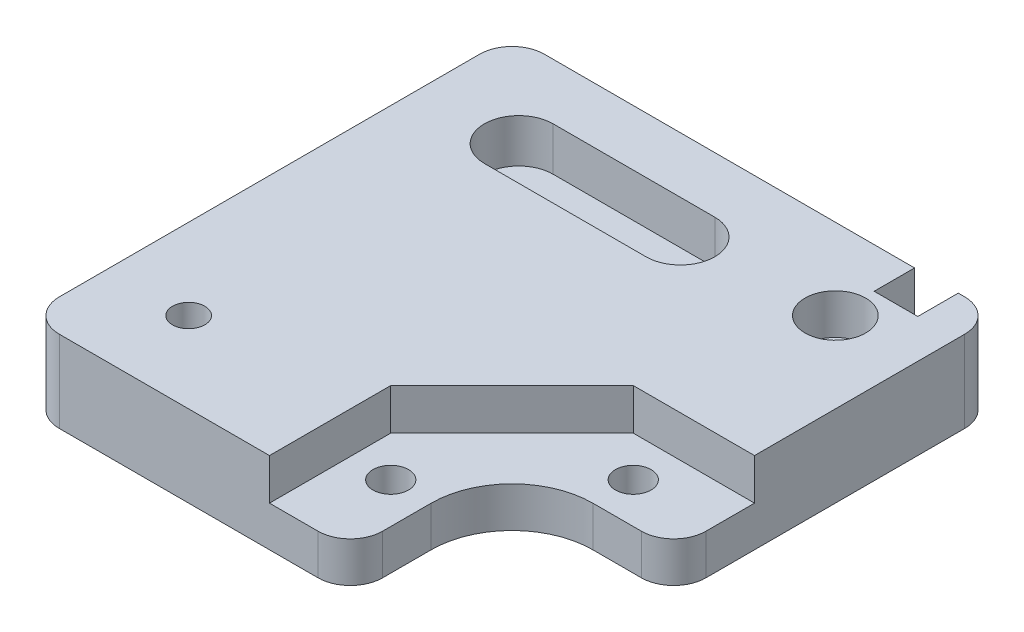
ISO-10303-21;
HEADER;
FILE_DESCRIPTION(('STEP AP214'),'2;1');
FILE_NAME('part.step','',(''),(''),'','','');
FILE_SCHEMA(('AUTOMOTIVE_DESIGN { 1 0 10303 214 1 1 1 1 }'));
ENDSEC;
DATA;
#1=APPLICATION_CONTEXT('core data for automotive mechanical design processes');
#2=APPLICATION_PROTOCOL_DEFINITION('international standard','automotive_design',2000,#1);
#3=PRODUCT_CONTEXT('',#1,'mechanical');
#4=PRODUCT('Part','Part','',(#3));
#5=PRODUCT_RELATED_PRODUCT_CATEGORY('part','',(#4));
#6=PRODUCT_DEFINITION_FORMATION('','',#4);
#7=PRODUCT_DEFINITION_CONTEXT('part definition',#1,'design');
#8=PRODUCT_DEFINITION('design','',#6,#7);
#9=PRODUCT_DEFINITION_SHAPE('','',#8);
#10=(LENGTH_UNIT() NAMED_UNIT(*) SI_UNIT(.MILLI.,.METRE.));
#11=(NAMED_UNIT(*) PLANE_ANGLE_UNIT() SI_UNIT($,.RADIAN.));
#12=(NAMED_UNIT(*) SI_UNIT($,.STERADIAN.) SOLID_ANGLE_UNIT());
#13=UNCERTAINTY_MEASURE_WITH_UNIT(LENGTH_MEASURE(1.E-05),#10,'distance_accuracy_value','');
#14=(GEOMETRIC_REPRESENTATION_CONTEXT(3) GLOBAL_UNCERTAINTY_ASSIGNED_CONTEXT((#13)) GLOBAL_UNIT_ASSIGNED_CONTEXT((#10,
#11,#12)) REPRESENTATION_CONTEXT('',''));
#15=CARTESIAN_POINT('',(0.,0.,0.));
#16=DIRECTION('',(0.,0.,1.));
#17=DIRECTION('',(1.,0.,0.));
#18=AXIS2_PLACEMENT_3D('',#15,#16,#17);
#19=CARTESIAN_POINT('',(20.,10.1,-60.));
#20=DIRECTION('',(0.,0.,1.));
#21=DIRECTION('',(1.,0.,0.));
#22=AXIS2_PLACEMENT_3D('',#19,#20,#21);
#23=PLANE('',#22);
#24=DIRECTION('',(0.,-1.,0.));
#25=VECTOR('',#24,1.);
#26=CARTESIAN_POINT('',(16.,10.1,-60.));
#27=LINE('',#26,#25);
#28=CARTESIAN_POINT('',(16.,10.1,-60.));
#29=VERTEX_POINT('',#28);
#30=CARTESIAN_POINT('',(16.,5.,-60.));
#31=VERTEX_POINT('',#30);
#32=EDGE_CURVE('E458',#29,#31,#27,.T.);
#33=ORIENTED_EDGE('',*,*,#32,.T.);
#34=DIRECTION('',(1.,0.,0.));
#35=VECTOR('',#34,1.);
#36=CARTESIAN_POINT('',(16.,5.,-60.));
#37=LINE('',#36,#35);
#38=CARTESIAN_POINT('',(15.2,5.,-60.));
#39=VERTEX_POINT('',#38);
#40=EDGE_CURVE('E54',#39,#31,#37,.T.);
#41=ORIENTED_EDGE('',*,*,#40,.F.);
#42=DIRECTION('',(0.,-1.,0.));
#43=VECTOR('',#42,1.);
#44=CARTESIAN_POINT('',(15.2,10.1,-60.));
#45=LINE('',#44,#43);
#46=CARTESIAN_POINT('',(15.2,10.1,-60.));
#47=VERTEX_POINT('',#46);
#48=EDGE_CURVE('E250',#47,#39,#45,.T.);
#49=ORIENTED_EDGE('',*,*,#48,.F.);
#50=DIRECTION('',(-1.,0.,0.));
#51=VECTOR('',#50,1.);
#52=CARTESIAN_POINT('',(20.,10.1,-60.));
#53=LINE('',#52,#51);
#54=EDGE_CURVE('E398',#29,#47,#53,.T.);
#55=ORIENTED_EDGE('',*,*,#54,.F.);
#56=EDGE_LOOP('',(#33,#41,#49,#55));
#57=FACE_BOUND('',#56,.T.);
#58=ADVANCED_FACE('F39',(#57),#23,.F.);
#59=CARTESIAN_POINT('',(10.0000000000014,0.,-50.0000000000072));
#60=DIRECTION('',(0.,1.,0.));
#61=DIRECTION('',(0.,0.,1.));
#62=AXIS2_PLACEMENT_3D('',#59,#60,#61);
#63=CYLINDRICAL_SURFACE('',#62,2.);
#64=CARTESIAN_POINT('',(10.0000000000014,0.,-50.0000000000072));
#65=DIRECTION('',(0.,1.,0.));
#66=DIRECTION('',(0.,0.,-1.));
#67=AXIS2_PLACEMENT_3D('',#64,#65,#66);
#68=CIRCLE('',#67,2.);
#69=CARTESIAN_POINT('',(10.0000000000014,0.,-52.0000000000072));
#70=VERTEX_POINT('',#69);
#71=EDGE_CURVE('E307',#70,#70,#68,.T.);
#72=ORIENTED_EDGE('',*,*,#71,.F.);
#73=EDGE_LOOP('',(#72));
#74=FACE_BOUND('',#73,.T.);
#75=CARTESIAN_POINT('',(10.0000000000014,5.1,-50.0000000000072));
#76=DIRECTION('',(0.,1.,0.));
#77=DIRECTION('',(0.,0.,1.));
#78=AXIS2_PLACEMENT_3D('',#75,#76,#77);
#79=CIRCLE('',#78,2.);
#80=CARTESIAN_POINT('',(10.0000000000014,5.1,-48.0000000000072));
#81=VERTEX_POINT('',#80);
#82=EDGE_CURVE('E297',#81,#81,#79,.F.);
#83=ORIENTED_EDGE('',*,*,#82,.F.);
#84=EDGE_LOOP('',(#83));
#85=FACE_BOUND('',#84,.T.);
#86=ADVANCED_FACE('F541',(#74,#85),#63,.F.);
#87=CARTESIAN_POINT('',(0.,10.1,0.));
#88=DIRECTION('',(-1.,0.,0.));
#89=DIRECTION('',(0.,0.,1.));
#90=AXIS2_PLACEMENT_3D('',#87,#88,#89);
#91=PLANE('',#90);
#92=DIRECTION('',(0.,0.,-1.));
#93=VECTOR('',#92,1.);
#94=CARTESIAN_POINT('',(0.,5.,0.));
#95=LINE('',#94,#93);
#96=CARTESIAN_POINT('',(0.,5.,-4.));
#97=VERTEX_POINT('',#96);
#98=CARTESIAN_POINT('',(0.,5.,-10.));
#99=VERTEX_POINT('',#98);
#100=EDGE_CURVE('E347',#97,#99,#95,.T.);
#101=ORIENTED_EDGE('',*,*,#100,.F.);
#102=DIRECTION('',(0.,-1.,0.));
#103=VECTOR('',#102,1.);
#104=CARTESIAN_POINT('',(0.,10.1,-4.));
#105=LINE('',#104,#103);
#106=CARTESIAN_POINT('',(0.,0.,-4.));
#107=VERTEX_POINT('',#106);
#108=EDGE_CURVE('E464',#97,#107,#105,.T.);
#109=ORIENTED_EDGE('',*,*,#108,.T.);
#110=DIRECTION('',(0.,0.,-1.));
#111=VECTOR('',#110,1.);
#112=CARTESIAN_POINT('',(0.,0.,0.));
#113=LINE('',#112,#111);
#114=CARTESIAN_POINT('',(0.,0.,-10.));
#115=VERTEX_POINT('',#114);
#116=EDGE_CURVE('E407',#107,#115,#113,.T.);
#117=ORIENTED_EDGE('',*,*,#116,.T.);
#118=DIRECTION('',(0.,-1.,0.));
#119=VECTOR('',#118,1.);
#120=CARTESIAN_POINT('',(0.,5.,-10.));
#121=LINE('',#120,#119);
#122=EDGE_CURVE('E423',#115,#99,#121,.F.);
#123=ORIENTED_EDGE('',*,*,#122,.T.);
#124=EDGE_LOOP('',(#101,#109,#117,#123));
#125=FACE_BOUND('',#124,.T.);
#126=ADVANCED_FACE('F522',(#125),#91,.F.);
#127=CARTESIAN_POINT('',(0.,10.1,-20.));
#128=DIRECTION('',(0.,0.,-1.));
#129=DIRECTION('',(-1.,0.,0.));
#130=AXIS2_PLACEMENT_3D('',#127,#128,#129);
#131=PLANE('',#130);
#132=DIRECTION('',(1.,0.,0.));
#133=VECTOR('',#132,1.);
#134=CARTESIAN_POINT('',(0.,0.,-20.));
#135=LINE('',#134,#133);
#136=CARTESIAN_POINT('',(10.,0.,-20.));
#137=VERTEX_POINT('',#136);
#138=CARTESIAN_POINT('',(16.,0.,-20.));
#139=VERTEX_POINT('',#138);
#140=EDGE_CURVE('E409',#137,#139,#135,.T.);
#141=ORIENTED_EDGE('',*,*,#140,.T.);
#142=DIRECTION('',(0.,-1.,0.));
#143=VECTOR('',#142,1.);
#144=CARTESIAN_POINT('',(16.,10.1,-20.));
#145=LINE('',#144,#143);
#146=CARTESIAN_POINT('',(16.,5.,-20.));
#147=VERTEX_POINT('',#146);
#148=EDGE_CURVE('E11',#139,#147,#145,.F.);
#149=ORIENTED_EDGE('',*,*,#148,.T.);
#150=DIRECTION('',(1.,0.,0.));
#151=VECTOR('',#150,1.);
#152=CARTESIAN_POINT('',(0.,5.,-20.));
#153=LINE('',#152,#151);
#154=CARTESIAN_POINT('',(10.,5.,-20.));
#155=VERTEX_POINT('',#154);
#156=EDGE_CURVE('E345',#155,#147,#153,.T.);
#157=ORIENTED_EDGE('',*,*,#156,.F.);
#158=DIRECTION('',(0.,-1.,0.));
#159=VECTOR('',#158,1.);
#160=CARTESIAN_POINT('',(10.,0.,-20.));
#161=LINE('',#160,#159);
#162=EDGE_CURVE('E401',#155,#137,#161,.T.);
#163=ORIENTED_EDGE('',*,*,#162,.T.);
#164=EDGE_LOOP('',(#141,#149,#157,#163));
#165=FACE_BOUND('',#164,.T.);
#166=ADVANCED_FACE('F530',(#165),#131,.F.);
#167=CARTESIAN_POINT('',(10.0000000000022,10.1,-25.0000000000111));
#168=DIRECTION('',(0.,-1.,0.));
#169=DIRECTION('',(0.,0.,-1.));
#170=AXIS2_PLACEMENT_3D('',#167,#168,#169);
#171=CYLINDRICAL_SURFACE('',#170,2.2);
#172=CARTESIAN_POINT('',(10.0000000000022,0.,-25.0000000000111));
#173=DIRECTION('',(0.,1.,0.));
#174=DIRECTION('',(0.,0.,1.));
#175=AXIS2_PLACEMENT_3D('',#172,#173,#174);
#176=CIRCLE('',#175,2.2);
#177=CARTESIAN_POINT('',(10.0000000000022,0.,-22.8000000000111));
#178=VERTEX_POINT('',#177);
#179=EDGE_CURVE('E384',#178,#178,#176,.T.);
#180=ORIENTED_EDGE('',*,*,#179,.F.);
#181=EDGE_LOOP('',(#180));
#182=FACE_BOUND('',#181,.T.);
#183=CARTESIAN_POINT('',(10.0000000000022,5.,-25.0000000000111));
#184=DIRECTION('',(0.,1.,0.));
#185=DIRECTION('',(0.,0.,1.));
#186=AXIS2_PLACEMENT_3D('',#183,#184,#185);
#187=CIRCLE('',#186,2.2);
#188=CARTESIAN_POINT('',(10.0000000000022,5.,-22.8000000000111));
#189=VERTEX_POINT('',#188);
#190=EDGE_CURVE('E342',#189,#189,#187,.T.);
#191=ORIENTED_EDGE('',*,*,#190,.T.);
#192=EDGE_LOOP('',(#191));
#193=FACE_BOUND('',#192,.T.);
#194=ADVANCED_FACE('F631',(#182,#193),#171,.F.);
#195=CARTESIAN_POINT('',(-5.0000000000111,10.1,-9.99999999999782));
#196=DIRECTION('',(0.,-1.,0.));
#197=DIRECTION('',(0.,0.,-1.));
#198=AXIS2_PLACEMENT_3D('',#195,#196,#197);
#199=CYLINDRICAL_SURFACE('',#198,2.2);
#200=CARTESIAN_POINT('',(-5.0000000000111,0.,-9.99999999999782));
#201=DIRECTION('',(0.,1.,0.));
#202=DIRECTION('',(0.,0.,-1.));
#203=AXIS2_PLACEMENT_3D('',#200,#201,#202);
#204=CIRCLE('',#203,2.2);
#205=CARTESIAN_POINT('',(-5.0000000000111,0.,-12.1999999999978));
#206=VERTEX_POINT('',#205);
#207=EDGE_CURVE('E375',#206,#206,#204,.T.);
#208=ORIENTED_EDGE('',*,*,#207,.F.);
#209=EDGE_LOOP('',(#208));
#210=FACE_BOUND('',#209,.T.);
#211=CARTESIAN_POINT('',(-5.0000000000111,5.,-9.99999999999782));
#212=DIRECTION('',(0.,1.,0.));
#213=DIRECTION('',(0.,0.,1.));
#214=AXIS2_PLACEMENT_3D('',#211,#212,#213);
#215=CIRCLE('',#214,2.2);
#216=CARTESIAN_POINT('',(-5.0000000000111,5.,-7.79999999999782));
#217=VERTEX_POINT('',#216);
#218=EDGE_CURVE('E336',#217,#217,#215,.T.);
#219=ORIENTED_EDGE('',*,*,#218,.T.);
#220=EDGE_LOOP('',(#219));
#221=FACE_BOUND('',#220,.T.);
#222=ADVANCED_FACE('F628',(#210,#221),#199,.F.);
#223=CARTESIAN_POINT('',(0.,10.1,0.));
#224=DIRECTION('',(0.,1.,0.));
#225=DIRECTION('',(0.,0.,1.));
#226=AXIS2_PLACEMENT_3D('',#223,#224,#225);
#227=PLANE('',#226);
#228=DIRECTION('',(0.,0.,-1.));
#229=VECTOR('',#228,1.);
#230=CARTESIAN_POINT('',(15.2,10.1,-55.));
#231=LINE('',#230,#229);
#232=CARTESIAN_POINT('',(15.2,10.1,-55.));
#233=VERTEX_POINT('',#232);
#234=EDGE_CURVE('E284',#233,#47,#231,.T.);
#235=ORIENTED_EDGE('',*,*,#234,.F.);
#236=DIRECTION('',(1.,0.,0.));
#237=VECTOR('',#236,1.);
#238=CARTESIAN_POINT('',(15.2,10.1,-55.));
#239=LINE('',#238,#237);
#240=CARTESIAN_POINT('',(9.8,10.1,-55.));
#241=VERTEX_POINT('',#240);
#242=EDGE_CURVE('E260',#241,#233,#239,.T.);
#243=ORIENTED_EDGE('',*,*,#242,.F.);
#244=DIRECTION('',(0.,0.,-1.));
#245=VECTOR('',#244,1.);
#246=CARTESIAN_POINT('',(9.8,10.1,-55.));
#247=LINE('',#246,#245);
#248=CARTESIAN_POINT('',(9.8,10.1,-60.));
#249=VERTEX_POINT('',#248);
#250=EDGE_CURVE('E286',#241,#249,#247,.T.);
#251=ORIENTED_EDGE('',*,*,#250,.T.);
#252=CARTESIAN_POINT('',(-36.,10.1,-60.));
#253=VERTEX_POINT('',#252);
#254=EDGE_CURVE('E397',#249,#253,#53,.T.);
#255=ORIENTED_EDGE('',*,*,#254,.T.);
#256=CARTESIAN_POINT('',(-36.,10.1,-56.));
#257=DIRECTION('',(0.,1.,0.));
#258=DIRECTION('',(0.,0.,1.));
#259=AXIS2_PLACEMENT_3D('',#256,#257,#258);
#260=CIRCLE('',#259,4.);
#261=CARTESIAN_POINT('',(-40.,10.1,-56.));
#262=VERTEX_POINT('',#261);
#263=EDGE_CURVE('E453',#253,#262,#260,.T.);
#264=ORIENTED_EDGE('',*,*,#263,.T.);
#265=DIRECTION('',(0.,0.,1.));
#266=VECTOR('',#265,1.);
#267=CARTESIAN_POINT('',(-40.,10.1,0.));
#268=LINE('',#267,#266);
#269=CARTESIAN_POINT('',(-40.,10.1,-4.));
#270=VERTEX_POINT('',#269);
#271=EDGE_CURVE('E388',#262,#270,#268,.T.);
#272=ORIENTED_EDGE('',*,*,#271,.T.);
#273=CARTESIAN_POINT('',(-36.,10.1,-4.));
#274=DIRECTION('',(0.,1.,0.));
#275=DIRECTION('',(0.,0.,1.));
#276=AXIS2_PLACEMENT_3D('',#273,#274,#275);
#277=CIRCLE('',#276,4.);
#278=CARTESIAN_POINT('',(-36.,10.1,0.));
#279=VERTEX_POINT('',#278);
#280=EDGE_CURVE('E455',#270,#279,#277,.T.);
#281=ORIENTED_EDGE('',*,*,#280,.T.);
#282=DIRECTION('',(1.,0.,0.));
#283=VECTOR('',#282,1.);
#284=CARTESIAN_POINT('',(0.,10.1,0.));
#285=LINE('',#284,#283);
#286=CARTESIAN_POINT('',(-10.,10.1,0.));
#287=VERTEX_POINT('',#286);
#288=EDGE_CURVE('E391',#279,#287,#285,.T.);
#289=ORIENTED_EDGE('',*,*,#288,.T.);
#290=DIRECTION('',(0.,0.,1.));
#291=VECTOR('',#290,1.);
#292=CARTESIAN_POINT('',(-10.,10.1,0.));
#293=LINE('',#292,#291);
#294=CARTESIAN_POINT('',(-10.,10.1,-15.));
#295=VERTEX_POINT('',#294);
#296=EDGE_CURVE('E313',#295,#287,#293,.T.);
#297=ORIENTED_EDGE('',*,*,#296,.F.);
#298=DIRECTION('',(-0.707106781186547,0.,0.707106781186547));
#299=VECTOR('',#298,1.);
#300=CARTESIAN_POINT('',(-10.,10.1,-15.));
#301=LINE('',#300,#299);
#302=CARTESIAN_POINT('',(5.,10.1,-30.));
#303=VERTEX_POINT('',#302);
#304=EDGE_CURVE('E328',#303,#295,#301,.T.);
#305=ORIENTED_EDGE('',*,*,#304,.F.);
#306=DIRECTION('',(-1.,0.,0.));
#307=VECTOR('',#306,1.);
#308=CARTESIAN_POINT('',(20.,10.1,-30.));
#309=LINE('',#308,#307);
#310=CARTESIAN_POINT('',(20.,10.1,-30.));
#311=VERTEX_POINT('',#310);
#312=EDGE_CURVE('E303',#311,#303,#309,.T.);
#313=ORIENTED_EDGE('',*,*,#312,.F.);
#314=DIRECTION('',(0.,0.,-1.));
#315=VECTOR('',#314,1.);
#316=CARTESIAN_POINT('',(20.,10.1,-20.));
#317=LINE('',#316,#315);
#318=CARTESIAN_POINT('',(20.,10.1,-56.));
#319=VERTEX_POINT('',#318);
#320=EDGE_CURVE('E394',#311,#319,#317,.T.);
#321=ORIENTED_EDGE('',*,*,#320,.T.);
#322=CARTESIAN_POINT('',(16.,10.1,-56.));
#323=DIRECTION('',(0.,1.,0.));
#324=DIRECTION('',(0.,0.,1.));
#325=AXIS2_PLACEMENT_3D('',#322,#323,#324);
#326=CIRCLE('',#325,4.);
#327=EDGE_CURVE('E451',#319,#29,#326,.T.);
#328=ORIENTED_EDGE('',*,*,#327,.T.);
#329=ORIENTED_EDGE('',*,*,#54,.T.);
#330=EDGE_LOOP('',(#235,#243,#251,#255,#264,#272,#281,#289,#297,#305,#313,#321,#328,#329));
#331=FACE_BOUND('',#330,.T.);
#332=CARTESIAN_POINT('',(10.0000000000014,10.1,-50.0000000000072));
#333=DIRECTION('',(0.,1.,0.));
#334=DIRECTION('',(0.,0.,1.));
#335=AXIS2_PLACEMENT_3D('',#332,#333,#334);
#336=CIRCLE('',#335,3.75);
#337=CARTESIAN_POINT('',(10.0000000000014,10.1,-46.2500000000072));
#338=VERTEX_POINT('',#337);
#339=EDGE_CURVE('E281',#338,#338,#336,.T.);
#340=ORIENTED_EDGE('',*,*,#339,.F.);
#341=EDGE_LOOP('',(#340));
#342=FACE_BOUND('',#341,.T.);
#343=CARTESIAN_POINT('',(-30.,10.1,-9.99999999999999));
#344=DIRECTION('',(0.,1.,0.));
#345=DIRECTION('',(0.,0.,1.));
#346=AXIS2_PLACEMENT_3D('',#343,#344,#345);
#347=CIRCLE('',#346,2.);
#348=CARTESIAN_POINT('',(-30.,10.1,-7.99999999999999));
#349=VERTEX_POINT('',#348);
#350=EDGE_CURVE('E304',#349,#349,#347,.T.);
#351=ORIENTED_EDGE('',*,*,#350,.F.);
#352=EDGE_LOOP('',(#351));
#353=FACE_BOUND('',#352,.T.);
#354=CARTESIAN_POINT('',(-28.0000000002413,10.1,-48.833248844171));
#355=DIRECTION('',(0.,1.,0.));
#356=DIRECTION('',(0.,0.,1.));
#357=AXIS2_PLACEMENT_3D('',#354,#355,#356);
#358=CIRCLE('',#357,4.25000000000002);
#359=CARTESIAN_POINT('',(-28.0000000002408,10.1,-53.0832488441711));
#360=VERTEX_POINT('',#359);
#361=CARTESIAN_POINT('',(-28.0000000002408,10.1,-44.583248844171));
#362=VERTEX_POINT('',#361);
#363=EDGE_CURVE('E349',#360,#362,#358,.T.);
#364=ORIENTED_EDGE('',*,*,#363,.F.);
#365=DIRECTION('',(-1.,0.,0.));
#366=VECTOR('',#365,1.);
#367=CARTESIAN_POINT('',(-28.0000000002408,10.1,-53.0832488441711));
#368=LINE('',#367,#366);
#369=CARTESIAN_POINT('',(-8.00000000024076,10.1,-53.0832488441711));
#370=VERTEX_POINT('',#369);
#371=EDGE_CURVE('E354',#370,#360,#368,.T.);
#372=ORIENTED_EDGE('',*,*,#371,.F.);
#373=CARTESIAN_POINT('',(-8.00000000024076,10.1,-48.833248844171));
#374=DIRECTION('',(0.,1.,0.));
#375=DIRECTION('',(0.,0.,1.));
#376=AXIS2_PLACEMENT_3D('',#373,#374,#375);
#377=CIRCLE('',#376,4.25000000000001);
#378=CARTESIAN_POINT('',(-8.00000000024076,10.1,-44.583248844171));
#379=VERTEX_POINT('',#378);
#380=EDGE_CURVE('E368',#379,#370,#377,.T.);
#381=ORIENTED_EDGE('',*,*,#380,.F.);
#382=DIRECTION('',(1.,0.,0.));
#383=VECTOR('',#382,1.);
#384=CARTESIAN_POINT('',(-28.0000000002408,10.1,-44.583248844171));
#385=LINE('',#384,#383);
#386=EDGE_CURVE('E365',#362,#379,#385,.T.);
#387=ORIENTED_EDGE('',*,*,#386,.F.);
#388=EDGE_LOOP('',(#364,#372,#381,#387));
#389=FACE_BOUND('',#388,.T.);
#390=ADVANCED_FACE('F494',(#331,#342,#353,#389),#227,.T.);
#391=CARTESIAN_POINT('',(0.,0.,0.));
#392=DIRECTION('',(0.,1.,0.));
#393=DIRECTION('',(0.,0.,1.));
#394=AXIS2_PLACEMENT_3D('',#391,#392,#393);
#395=PLANE('',#394);
#396=CARTESIAN_POINT('',(-30.,0.,-9.99999999999999));
#397=DIRECTION('',(0.,1.,0.));
#398=DIRECTION('',(0.,0.,1.));
#399=AXIS2_PLACEMENT_3D('',#396,#397,#398);
#400=CIRCLE('',#399,2.);
#401=CARTESIAN_POINT('',(-30.,0.,-7.99999999999999));
#402=VERTEX_POINT('',#401);
#403=EDGE_CURVE('E300',#402,#402,#400,.T.);
#404=ORIENTED_EDGE('',*,*,#403,.T.);
#405=EDGE_LOOP('',(#404));
#406=FACE_BOUND('',#405,.T.);
#407=ORIENTED_EDGE('',*,*,#71,.T.);
#408=EDGE_LOOP('',(#407));
#409=FACE_BOUND('',#408,.T.);
#410=DIRECTION('',(1.,0.,0.));
#411=VECTOR('',#410,1.);
#412=CARTESIAN_POINT('',(0.,0.,0.));
#413=LINE('',#412,#411);
#414=CARTESIAN_POINT('',(-36.,0.,0.));
#415=VERTEX_POINT('',#414);
#416=CARTESIAN_POINT('',(-4.,0.,0.));
#417=VERTEX_POINT('',#416);
#418=EDGE_CURVE('E404',#415,#417,#413,.T.);
#419=ORIENTED_EDGE('',*,*,#418,.F.);
#420=CARTESIAN_POINT('',(-36.,0.,-4.));
#421=DIRECTION('',(0.,1.,0.));
#422=DIRECTION('',(0.,0.,1.));
#423=AXIS2_PLACEMENT_3D('',#420,#421,#422);
#424=CIRCLE('',#423,4.);
#425=CARTESIAN_POINT('',(-40.,0.,-4.));
#426=VERTEX_POINT('',#425);
#427=EDGE_CURVE('E444',#415,#426,#424,.F.);
#428=ORIENTED_EDGE('',*,*,#427,.T.);
#429=DIRECTION('',(0.,0.,1.));
#430=VECTOR('',#429,1.);
#431=CARTESIAN_POINT('',(-40.,0.,0.));
#432=LINE('',#431,#430);
#433=CARTESIAN_POINT('',(-40.,0.,-56.));
#434=VERTEX_POINT('',#433);
#435=EDGE_CURVE('E387',#434,#426,#432,.T.);
#436=ORIENTED_EDGE('',*,*,#435,.F.);
#437=CARTESIAN_POINT('',(-36.,0.,-56.));
#438=DIRECTION('',(0.,1.,0.));
#439=DIRECTION('',(0.,0.,1.));
#440=AXIS2_PLACEMENT_3D('',#437,#438,#439);
#441=CIRCLE('',#440,4.);
#442=CARTESIAN_POINT('',(-36.,0.,-60.));
#443=VERTEX_POINT('',#442);
#444=EDGE_CURVE('E442',#434,#443,#441,.F.);
#445=ORIENTED_EDGE('',*,*,#444,.T.);
#446=DIRECTION('',(-1.,0.,0.));
#447=VECTOR('',#446,1.);
#448=CARTESIAN_POINT('',(20.,0.,-60.));
#449=LINE('',#448,#447);
#450=CARTESIAN_POINT('',(16.,0.,-60.));
#451=VERTEX_POINT('',#450);
#452=EDGE_CURVE('E392',#451,#443,#449,.T.);
#453=ORIENTED_EDGE('',*,*,#452,.F.);
#454=CARTESIAN_POINT('',(16.,0.,-56.));
#455=DIRECTION('',(0.,1.,0.));
#456=DIRECTION('',(0.,0.,1.));
#457=AXIS2_PLACEMENT_3D('',#454,#455,#456);
#458=CIRCLE('',#457,4.);
#459=CARTESIAN_POINT('',(20.,0.,-56.));
#460=VERTEX_POINT('',#459);
#461=EDGE_CURVE('E436',#451,#460,#458,.F.);
#462=ORIENTED_EDGE('',*,*,#461,.T.);
#463=DIRECTION('',(0.,0.,-1.));
#464=VECTOR('',#463,1.);
#465=CARTESIAN_POINT('',(20.,0.,-20.));
#466=LINE('',#465,#464);
#467=CARTESIAN_POINT('',(20.,0.,-24.));
#468=VERTEX_POINT('',#467);
#469=EDGE_CURVE('E412',#468,#460,#466,.T.);
#470=ORIENTED_EDGE('',*,*,#469,.F.);
#471=CARTESIAN_POINT('',(16.,0.,-24.));
#472=DIRECTION('',(0.,1.,0.));
#473=DIRECTION('',(0.,0.,1.));
#474=AXIS2_PLACEMENT_3D('',#471,#472,#473);
#475=CIRCLE('',#474,4.);
#476=EDGE_CURVE('E438',#468,#139,#475,.F.);
#477=ORIENTED_EDGE('',*,*,#476,.T.);
#478=ORIENTED_EDGE('',*,*,#140,.F.);
#479=CARTESIAN_POINT('',(10.,0.,-10.));
#480=DIRECTION('',(0.,1.,0.));
#481=DIRECTION('',(0.,0.,1.));
#482=AXIS2_PLACEMENT_3D('',#479,#480,#481);
#483=CIRCLE('',#482,10.);
#484=EDGE_CURVE('E426',#137,#115,#483,.T.);
#485=ORIENTED_EDGE('',*,*,#484,.T.);
#486=ORIENTED_EDGE('',*,*,#116,.F.);
#487=CARTESIAN_POINT('',(-4.,0.,-4.));
#488=DIRECTION('',(0.,1.,0.));
#489=DIRECTION('',(0.,0.,1.));
#490=AXIS2_PLACEMENT_3D('',#487,#488,#489);
#491=CIRCLE('',#490,4.);
#492=EDGE_CURVE('E440',#107,#417,#491,.F.);
#493=ORIENTED_EDGE('',*,*,#492,.T.);
#494=EDGE_LOOP('',(#419,#428,#436,#445,#453,#462,#470,#477,#478,#485,#486,#493));
#495=FACE_BOUND('',#494,.T.);
#496=ORIENTED_EDGE('',*,*,#179,.T.);
#497=EDGE_LOOP('',(#496));
#498=FACE_BOUND('',#497,.T.);
#499=ORIENTED_EDGE('',*,*,#207,.T.);
#500=EDGE_LOOP('',(#499));
#501=FACE_BOUND('',#500,.T.);
#502=ADVANCED_FACE('F481',(#406,#409,#495,#498,#501),#395,.F.);
#503=CARTESIAN_POINT('',(-40.,10.1,0.));
#504=DIRECTION('',(1.,0.,0.));
#505=DIRECTION('',(0.,0.,-1.));
#506=AXIS2_PLACEMENT_3D('',#503,#504,#505);
#507=PLANE('',#506);
#508=ORIENTED_EDGE('',*,*,#435,.T.);
#509=DIRECTION('',(0.,-1.,0.));
#510=VECTOR('',#509,1.);
#511=CARTESIAN_POINT('',(-40.,10.1,-4.));
#512=LINE('',#511,#510);
#513=EDGE_CURVE('E449',#426,#270,#512,.F.);
#514=ORIENTED_EDGE('',*,*,#513,.T.);
#515=ORIENTED_EDGE('',*,*,#271,.F.);
#516=DIRECTION('',(0.,-1.,0.));
#517=VECTOR('',#516,1.);
#518=CARTESIAN_POINT('',(-40.,10.1,-56.));
#519=LINE('',#518,#517);
#520=EDGE_CURVE('E446',#262,#434,#519,.T.);
#521=ORIENTED_EDGE('',*,*,#520,.T.);
#522=EDGE_LOOP('',(#508,#514,#515,#521));
#523=FACE_BOUND('',#522,.T.);
#524=ADVANCED_FACE('F637',(#523),#507,.F.);
#525=CARTESIAN_POINT('',(0.,10.1,0.));
#526=DIRECTION('',(0.,0.,-1.));
#527=DIRECTION('',(-1.,0.,0.));
#528=AXIS2_PLACEMENT_3D('',#525,#526,#527);
#529=PLANE('',#528);
#530=ORIENTED_EDGE('',*,*,#288,.F.);
#531=DIRECTION('',(0.,-1.,0.));
#532=VECTOR('',#531,1.);
#533=CARTESIAN_POINT('',(-36.,10.1,0.));
#534=LINE('',#533,#532);
#535=EDGE_CURVE('E433',#279,#415,#534,.T.);
#536=ORIENTED_EDGE('',*,*,#535,.T.);
#537=ORIENTED_EDGE('',*,*,#418,.T.);
#538=DIRECTION('',(0.,-1.,0.));
#539=VECTOR('',#538,1.);
#540=CARTESIAN_POINT('',(-4.,10.1,0.));
#541=LINE('',#540,#539);
#542=CARTESIAN_POINT('',(-4.,5.,0.));
#543=VERTEX_POINT('',#542);
#544=EDGE_CURVE('E431',#417,#543,#541,.F.);
#545=ORIENTED_EDGE('',*,*,#544,.T.);
#546=DIRECTION('',(1.,0.,0.));
#547=VECTOR('',#546,1.);
#548=CARTESIAN_POINT('',(20.,5.,0.));
#549=LINE('',#548,#547);
#550=CARTESIAN_POINT('',(-10.,5.,0.));
#551=VERTEX_POINT('',#550);
#552=EDGE_CURVE('E322',#551,#543,#549,.T.);
#553=ORIENTED_EDGE('',*,*,#552,.F.);
#554=DIRECTION('',(0.,1.,0.));
#555=VECTOR('',#554,1.);
#556=CARTESIAN_POINT('',(-10.,5.,0.));
#557=LINE('',#556,#555);
#558=EDGE_CURVE('E333',#551,#287,#557,.T.);
#559=ORIENTED_EDGE('',*,*,#558,.T.);
#560=EDGE_LOOP('',(#530,#536,#537,#545,#553,#559));
#561=FACE_BOUND('',#560,.T.);
#562=ADVANCED_FACE('F512',(#561),#529,.F.);
#563=CARTESIAN_POINT('',(20.,10.1,-20.));
#564=DIRECTION('',(-1.,0.,0.));
#565=DIRECTION('',(0.,0.,1.));
#566=AXIS2_PLACEMENT_3D('',#563,#564,#565);
#567=PLANE('',#566);
#568=DIRECTION('',(0.,0.,-1.));
#569=VECTOR('',#568,1.);
#570=CARTESIAN_POINT('',(20.,5.,0.));
#571=LINE('',#570,#569);
#572=CARTESIAN_POINT('',(20.,5.,-24.));
#573=VERTEX_POINT('',#572);
#574=CARTESIAN_POINT('',(20.,5.,-30.));
#575=VERTEX_POINT('',#574);
#576=EDGE_CURVE('E310',#573,#575,#571,.T.);
#577=ORIENTED_EDGE('',*,*,#576,.F.);
#578=DIRECTION('',(0.,-1.,0.));
#579=VECTOR('',#578,1.);
#580=CARTESIAN_POINT('',(20.,10.1,-24.));
#581=LINE('',#580,#579);
#582=EDGE_CURVE('E47',#573,#468,#581,.T.);
#583=ORIENTED_EDGE('',*,*,#582,.T.);
#584=ORIENTED_EDGE('',*,*,#469,.T.);
#585=DIRECTION('',(0.,-1.,0.));
#586=VECTOR('',#585,1.);
#587=CARTESIAN_POINT('',(20.,10.1,-56.));
#588=LINE('',#587,#586);
#589=EDGE_CURVE('E470',#460,#319,#588,.F.);
#590=ORIENTED_EDGE('',*,*,#589,.T.);
#591=ORIENTED_EDGE('',*,*,#320,.F.);
#592=DIRECTION('',(0.,1.,0.));
#593=VECTOR('',#592,1.);
#594=CARTESIAN_POINT('',(20.,5.,-30.));
#595=LINE('',#594,#593);
#596=EDGE_CURVE('E325',#575,#311,#595,.T.);
#597=ORIENTED_EDGE('',*,*,#596,.F.);
#598=EDGE_LOOP('',(#577,#583,#584,#590,#591,#597));
#599=FACE_BOUND('',#598,.T.);
#600=ADVANCED_FACE('F475',(#599),#567,.F.);
#601=ORIENTED_EDGE('',*,*,#254,.F.);
#602=DIRECTION('',(0.,1.,0.));
#603=VECTOR('',#602,1.);
#604=CARTESIAN_POINT('',(9.8,10.1,-60.));
#605=LINE('',#604,#603);
#606=CARTESIAN_POINT('',(9.8,5.,-60.));
#607=VERTEX_POINT('',#606);
#608=EDGE_CURVE('E275',#607,#249,#605,.T.);
#609=ORIENTED_EDGE('',*,*,#608,.F.);
#610=DIRECTION('',(1.,0.,0.));
#611=VECTOR('',#610,1.);
#612=CARTESIAN_POINT('',(9.8,5.,-60.));
#613=LINE('',#612,#611);
#614=CARTESIAN_POINT('',(9.,5.,-60.));
#615=VERTEX_POINT('',#614);
#616=EDGE_CURVE('E272',#615,#607,#613,.T.);
#617=ORIENTED_EDGE('',*,*,#616,.F.);
#618=DIRECTION('',(0.,1.,0.));
#619=VECTOR('',#618,1.);
#620=CARTESIAN_POINT('',(9.,5.,-60.));
#621=LINE('',#620,#619);
#622=CARTESIAN_POINT('',(9.,1.8,-60.));
#623=VERTEX_POINT('',#622);
#624=EDGE_CURVE('E269',#623,#615,#621,.T.);
#625=ORIENTED_EDGE('',*,*,#624,.F.);
#626=DIRECTION('',(-1.,0.,0.));
#627=VECTOR('',#626,1.);
#628=CARTESIAN_POINT('',(16.,1.8,-60.));
#629=LINE('',#628,#627);
#630=CARTESIAN_POINT('',(16.,1.8,-60.));
#631=VERTEX_POINT('',#630);
#632=EDGE_CURVE('E267',#631,#623,#629,.T.);
#633=ORIENTED_EDGE('',*,*,#632,.F.);
#634=EDGE_CURVE('E457',#631,#451,#27,.T.);
#635=ORIENTED_EDGE('',*,*,#634,.T.);
#636=ORIENTED_EDGE('',*,*,#452,.T.);
#637=DIRECTION('',(0.,-1.,0.));
#638=VECTOR('',#637,1.);
#639=CARTESIAN_POINT('',(-36.,10.1,-60.));
#640=LINE('',#639,#638);
#641=EDGE_CURVE('E461',#443,#253,#640,.F.);
#642=ORIENTED_EDGE('',*,*,#641,.T.);
#643=EDGE_LOOP('',(#601,#609,#617,#625,#633,#635,#636,#642));
#644=FACE_BOUND('',#643,.T.);
#645=ADVANCED_FACE('F544',(#644),#23,.F.);
#646=CARTESIAN_POINT('',(-28.0000000002413,4.7,-48.833248844171));
#647=DIRECTION('',(0.,1.,0.));
#648=DIRECTION('',(0.,0.,1.));
#649=AXIS2_PLACEMENT_3D('',#646,#647,#648);
#650=CYLINDRICAL_SURFACE('',#649,4.25000000000002);
#651=ORIENTED_EDGE('',*,*,#363,.T.);
#652=DIRECTION('',(0.,1.,0.));
#653=VECTOR('',#652,1.);
#654=CARTESIAN_POINT('',(-28.0000000002408,4.7,-44.583248844171));
#655=LINE('',#654,#653);
#656=CARTESIAN_POINT('',(-28.0000000002408,4.7,-44.583248844171));
#657=VERTEX_POINT('',#656);
#658=EDGE_CURVE('E363',#657,#362,#655,.T.);
#659=ORIENTED_EDGE('',*,*,#658,.F.);
#660=CARTESIAN_POINT('',(-28.0000000002413,4.7,-48.833248844171));
#661=DIRECTION('',(0.,1.,0.));
#662=DIRECTION('',(0.,0.,1.));
#663=AXIS2_PLACEMENT_3D('',#660,#661,#662);
#664=CIRCLE('',#663,4.25000000000002);
#665=CARTESIAN_POINT('',(-28.0000000002408,4.7,-53.0832488441711));
#666=VERTEX_POINT('',#665);
#667=EDGE_CURVE('E350',#666,#657,#664,.T.);
#668=ORIENTED_EDGE('',*,*,#667,.F.);
#669=DIRECTION('',(0.,1.,0.));
#670=VECTOR('',#669,1.);
#671=CARTESIAN_POINT('',(-28.0000000002408,4.7,-53.0832488441711));
#672=LINE('',#671,#670);
#673=EDGE_CURVE('E373',#666,#360,#672,.T.);
#674=ORIENTED_EDGE('',*,*,#673,.T.);
#675=EDGE_LOOP('',(#651,#659,#668,#674));
#676=FACE_BOUND('',#675,.T.);
#677=ADVANCED_FACE('F554',(#676),#650,.F.);
#678=CARTESIAN_POINT('',(-28.0000000002408,4.7,-53.0832488441711));
#679=DIRECTION('',(0.,0.,-1.));
#680=DIRECTION('',(-1.,0.,0.));
#681=AXIS2_PLACEMENT_3D('',#678,#679,#680);
#682=PLANE('',#681);
#683=ORIENTED_EDGE('',*,*,#371,.T.);
#684=ORIENTED_EDGE('',*,*,#673,.F.);
#685=DIRECTION('',(-1.,0.,0.));
#686=VECTOR('',#685,1.);
#687=CARTESIAN_POINT('',(-28.0000000002408,4.7,-53.0832488441711));
#688=LINE('',#687,#686);
#689=CARTESIAN_POINT('',(-8.00000000024076,4.7,-53.0832488441711));
#690=VERTEX_POINT('',#689);
#691=EDGE_CURVE('E360',#690,#666,#688,.T.);
#692=ORIENTED_EDGE('',*,*,#691,.F.);
#693=DIRECTION('',(0.,1.,0.));
#694=VECTOR('',#693,1.);
#695=CARTESIAN_POINT('',(-8.00000000024076,4.7,-53.0832488441711));
#696=LINE('',#695,#694);
#697=EDGE_CURVE('E376',#690,#370,#696,.T.);
#698=ORIENTED_EDGE('',*,*,#697,.T.);
#699=EDGE_LOOP('',(#683,#684,#692,#698));
#700=FACE_BOUND('',#699,.T.);
#701=ADVANCED_FACE('F559',(#700),#682,.F.);
#702=CARTESIAN_POINT('',(-8.00000000024076,4.7,-48.833248844171));
#703=DIRECTION('',(0.,1.,0.));
#704=DIRECTION('',(0.,0.,1.));
#705=AXIS2_PLACEMENT_3D('',#702,#703,#704);
#706=CYLINDRICAL_SURFACE('',#705,4.25000000000001);
#707=ORIENTED_EDGE('',*,*,#380,.T.);
#708=ORIENTED_EDGE('',*,*,#697,.F.);
#709=CARTESIAN_POINT('',(-8.00000000024076,4.7,-48.833248844171));
#710=DIRECTION('',(0.,1.,0.));
#711=DIRECTION('',(0.,0.,1.));
#712=AXIS2_PLACEMENT_3D('',#709,#710,#711);
#713=CIRCLE('',#712,4.25000000000001);
#714=CARTESIAN_POINT('',(-8.00000000024076,4.7,-44.583248844171));
#715=VERTEX_POINT('',#714);
#716=EDGE_CURVE('E357',#715,#690,#713,.T.);
#717=ORIENTED_EDGE('',*,*,#716,.F.);
#718=DIRECTION('',(0.,1.,0.));
#719=VECTOR('',#718,1.);
#720=CARTESIAN_POINT('',(-8.00000000024076,4.7,-44.583248844171));
#721=LINE('',#720,#719);
#722=EDGE_CURVE('E378',#715,#379,#721,.T.);
#723=ORIENTED_EDGE('',*,*,#722,.T.);
#724=EDGE_LOOP('',(#707,#708,#717,#723));
#725=FACE_BOUND('',#724,.T.);
#726=ADVANCED_FACE('F620',(#725),#706,.F.);
#727=CARTESIAN_POINT('',(-28.0000000002408,4.7,-44.583248844171));
#728=DIRECTION('',(0.,0.,1.));
#729=DIRECTION('',(1.,0.,0.));
#730=AXIS2_PLACEMENT_3D('',#727,#728,#729);
#731=PLANE('',#730);
#732=ORIENTED_EDGE('',*,*,#386,.T.);
#733=ORIENTED_EDGE('',*,*,#722,.F.);
#734=DIRECTION('',(1.,0.,0.));
#735=VECTOR('',#734,1.);
#736=CARTESIAN_POINT('',(-28.0000000002408,4.7,-44.583248844171));
#737=LINE('',#736,#735);
#738=EDGE_CURVE('E353',#657,#715,#737,.T.);
#739=ORIENTED_EDGE('',*,*,#738,.F.);
#740=ORIENTED_EDGE('',*,*,#658,.T.);
#741=EDGE_LOOP('',(#732,#733,#739,#740));
#742=FACE_BOUND('',#741,.T.);
#743=ADVANCED_FACE('F616',(#742),#731,.F.);
#744=CARTESIAN_POINT('',(-28.0000000002413,4.7,-48.833248844171));
#745=DIRECTION('',(0.,1.,0.));
#746=DIRECTION('',(0.,0.,1.));
#747=AXIS2_PLACEMENT_3D('',#744,#745,#746);
#748=PLANE('',#747);
#749=ORIENTED_EDGE('',*,*,#667,.T.);
#750=ORIENTED_EDGE('',*,*,#738,.T.);
#751=ORIENTED_EDGE('',*,*,#716,.T.);
#752=ORIENTED_EDGE('',*,*,#691,.T.);
#753=EDGE_LOOP('',(#749,#750,#751,#752));
#754=FACE_BOUND('',#753,.T.);
#755=ADVANCED_FACE('F606',(#754),#748,.T.);
#756=CARTESIAN_POINT('',(0.,5.,0.));
#757=DIRECTION('',(0.,1.,0.));
#758=DIRECTION('',(0.,0.,1.));
#759=AXIS2_PLACEMENT_3D('',#756,#757,#758);
#760=PLANE('',#759);
#761=ORIENTED_EDGE('',*,*,#218,.F.);
#762=EDGE_LOOP('',(#761));
#763=FACE_BOUND('',#762,.T.);
#764=ORIENTED_EDGE('',*,*,#190,.F.);
#765=EDGE_LOOP('',(#764));
#766=FACE_BOUND('',#765,.T.);
#767=ORIENTED_EDGE('',*,*,#552,.T.);
#768=CARTESIAN_POINT('',(-4.,5.,-4.));
#769=DIRECTION('',(0.,1.,0.));
#770=DIRECTION('',(0.,0.,1.));
#771=AXIS2_PLACEMENT_3D('',#768,#769,#770);
#772=CIRCLE('',#771,4.);
#773=EDGE_CURVE('E468',#543,#97,#772,.T.);
#774=ORIENTED_EDGE('',*,*,#773,.T.);
#775=ORIENTED_EDGE('',*,*,#100,.T.);
#776=CARTESIAN_POINT('',(10.,5.,-10.));
#777=DIRECTION('',(0.,1.,0.));
#778=DIRECTION('',(0.,0.,1.));
#779=AXIS2_PLACEMENT_3D('',#776,#777,#778);
#780=CIRCLE('',#779,10.);
#781=EDGE_CURVE('E429',#99,#155,#780,.F.);
#782=ORIENTED_EDGE('',*,*,#781,.T.);
#783=ORIENTED_EDGE('',*,*,#156,.T.);
#784=CARTESIAN_POINT('',(16.,5.,-24.));
#785=DIRECTION('',(0.,1.,0.));
#786=DIRECTION('',(0.,0.,1.));
#787=AXIS2_PLACEMENT_3D('',#784,#785,#786);
#788=CIRCLE('',#787,4.);
#789=EDGE_CURVE('E62',#147,#573,#788,.T.);
#790=ORIENTED_EDGE('',*,*,#789,.T.);
#791=ORIENTED_EDGE('',*,*,#576,.T.);
#792=DIRECTION('',(-1.,0.,0.));
#793=VECTOR('',#792,1.);
#794=CARTESIAN_POINT('',(20.,5.,-30.));
#795=LINE('',#794,#793);
#796=CARTESIAN_POINT('',(5.,5.,-30.));
#797=VERTEX_POINT('',#796);
#798=EDGE_CURVE('E312',#575,#797,#795,.T.);
#799=ORIENTED_EDGE('',*,*,#798,.T.);
#800=DIRECTION('',(-0.707106781186547,0.,0.707106781186547));
#801=VECTOR('',#800,1.);
#802=CARTESIAN_POINT('',(-10.,5.,-15.));
#803=LINE('',#802,#801);
#804=CARTESIAN_POINT('',(-10.,5.,-15.));
#805=VERTEX_POINT('',#804);
#806=EDGE_CURVE('E316',#797,#805,#803,.T.);
#807=ORIENTED_EDGE('',*,*,#806,.T.);
#808=DIRECTION('',(0.,0.,1.));
#809=VECTOR('',#808,1.);
#810=CARTESIAN_POINT('',(-10.,5.,0.));
#811=LINE('',#810,#809);
#812=EDGE_CURVE('E319',#805,#551,#811,.T.);
#813=ORIENTED_EDGE('',*,*,#812,.T.);
#814=EDGE_LOOP('',(#767,#774,#775,#782,#783,#790,#791,#799,#807,#813));
#815=FACE_BOUND('',#814,.T.);
#816=ADVANCED_FACE('F503',(#763,#766,#815),#760,.T.);
#817=CARTESIAN_POINT('',(-10.,5.,0.));
#818=DIRECTION('',(-1.,0.,0.));
#819=DIRECTION('',(0.,0.,1.));
#820=AXIS2_PLACEMENT_3D('',#817,#818,#819);
#821=PLANE('',#820);
#822=ORIENTED_EDGE('',*,*,#296,.T.);
#823=ORIENTED_EDGE('',*,*,#558,.F.);
#824=ORIENTED_EDGE('',*,*,#812,.F.);
#825=DIRECTION('',(0.,1.,0.));
#826=VECTOR('',#825,1.);
#827=CARTESIAN_POINT('',(-10.,5.,-15.));
#828=LINE('',#827,#826);
#829=EDGE_CURVE('E337',#805,#295,#828,.T.);
#830=ORIENTED_EDGE('',*,*,#829,.T.);
#831=EDGE_LOOP('',(#822,#823,#824,#830));
#832=FACE_BOUND('',#831,.T.);
#833=ADVANCED_FACE('F509',(#832),#821,.F.);
#834=CARTESIAN_POINT('',(-10.,5.,-15.));
#835=DIRECTION('',(-0.707106781186548,0.,-0.707106781186548));
#836=DIRECTION('',(-0.707106781186548,0.,0.707106781186548));
#837=AXIS2_PLACEMENT_3D('',#834,#835,#836);
#838=PLANE('',#837);
#839=ORIENTED_EDGE('',*,*,#304,.T.);
#840=ORIENTED_EDGE('',*,*,#829,.F.);
#841=ORIENTED_EDGE('',*,*,#806,.F.);
#842=DIRECTION('',(0.,1.,0.));
#843=VECTOR('',#842,1.);
#844=CARTESIAN_POINT('',(5.,5.,-30.));
#845=LINE('',#844,#843);
#846=EDGE_CURVE('E339',#797,#303,#845,.T.);
#847=ORIENTED_EDGE('',*,*,#846,.T.);
#848=EDGE_LOOP('',(#839,#840,#841,#847));
#849=FACE_BOUND('',#848,.T.);
#850=ADVANCED_FACE('F507',(#849),#838,.F.);
#851=CARTESIAN_POINT('',(20.,5.,-30.));
#852=DIRECTION('',(0.,0.,-1.));
#853=DIRECTION('',(-1.,0.,0.));
#854=AXIS2_PLACEMENT_3D('',#851,#852,#853);
#855=PLANE('',#854);
#856=ORIENTED_EDGE('',*,*,#312,.T.);
#857=ORIENTED_EDGE('',*,*,#846,.F.);
#858=ORIENTED_EDGE('',*,*,#798,.F.);
#859=ORIENTED_EDGE('',*,*,#596,.T.);
#860=EDGE_LOOP('',(#856,#857,#858,#859));
#861=FACE_BOUND('',#860,.T.);
#862=ADVANCED_FACE('F500',(#861),#855,.F.);
#863=CARTESIAN_POINT('',(-30.,0.,-9.99999999999999));
#864=DIRECTION('',(0.,1.,0.));
#865=DIRECTION('',(0.,0.,1.));
#866=AXIS2_PLACEMENT_3D('',#863,#864,#865);
#867=CYLINDRICAL_SURFACE('',#866,2.);
#868=ORIENTED_EDGE('',*,*,#403,.F.);
#869=EDGE_LOOP('',(#868));
#870=FACE_BOUND('',#869,.T.);
#871=ORIENTED_EDGE('',*,*,#350,.T.);
#872=EDGE_LOOP('',(#871));
#873=FACE_BOUND('',#872,.T.);
#874=ADVANCED_FACE('F596',(#870,#873),#867,.F.);
#875=CARTESIAN_POINT('',(10.0000000000014,5.1,-50.0000000000072));
#876=DIRECTION('',(0.,1.,0.));
#877=DIRECTION('',(0.,0.,1.));
#878=AXIS2_PLACEMENT_3D('',#875,#876,#877);
#879=PLANE('',#878);
#880=CARTESIAN_POINT('',(10.0000000000014,5.1,-50.0000000000072));
#881=DIRECTION('',(0.,1.,0.));
#882=DIRECTION('',(0.,0.,1.));
#883=AXIS2_PLACEMENT_3D('',#880,#881,#882);
#884=CIRCLE('',#883,3.75);
#885=CARTESIAN_POINT('',(10.0000000000014,5.1,-46.2500000000072));
#886=VERTEX_POINT('',#885);
#887=EDGE_CURVE('E294',#886,#886,#884,.T.);
#888=ORIENTED_EDGE('',*,*,#887,.T.);
#889=EDGE_LOOP('',(#888));
#890=FACE_BOUND('',#889,.T.);
#891=ORIENTED_EDGE('',*,*,#82,.T.);
#892=EDGE_LOOP('',(#891));
#893=FACE_BOUND('',#892,.T.);
#894=ADVANCED_FACE('F592',(#890,#893),#879,.T.);
#895=CARTESIAN_POINT('',(10.0000000000014,5.1,-50.0000000000072));
#896=DIRECTION('',(0.,1.,0.));
#897=DIRECTION('',(0.,0.,1.));
#898=AXIS2_PLACEMENT_3D('',#895,#896,#897);
#899=CYLINDRICAL_SURFACE('',#898,3.75);
#900=ORIENTED_EDGE('',*,*,#887,.F.);
#901=EDGE_LOOP('',(#900));
#902=FACE_BOUND('',#901,.T.);
#903=ORIENTED_EDGE('',*,*,#339,.T.);
#904=EDGE_LOOP('',(#903));
#905=FACE_BOUND('',#904,.T.);
#906=ADVANCED_FACE('F595',(#902,#905),#899,.F.);
#907=CARTESIAN_POINT('',(10.,10.1,-10.));
#908=DIRECTION('',(0.,1.,0.));
#909=DIRECTION('',(0.,0.,1.));
#910=AXIS2_PLACEMENT_3D('',#907,#908,#909);
#911=CYLINDRICAL_SURFACE('',#910,10.);
#912=ORIENTED_EDGE('',*,*,#781,.F.);
#913=ORIENTED_EDGE('',*,*,#122,.F.);
#914=ORIENTED_EDGE('',*,*,#484,.F.);
#915=ORIENTED_EDGE('',*,*,#162,.F.);
#916=EDGE_LOOP('',(#912,#913,#914,#915));
#917=FACE_BOUND('',#916,.T.);
#918=ADVANCED_FACE('F527',(#917),#911,.F.);
#919=CARTESIAN_POINT('',(-36.,10.1,-4.));
#920=DIRECTION('',(0.,-1.,0.));
#921=DIRECTION('',(0.,0.,-1.));
#922=AXIS2_PLACEMENT_3D('',#919,#920,#921);
#923=CYLINDRICAL_SURFACE('',#922,4.);
#924=ORIENTED_EDGE('',*,*,#280,.F.);
#925=ORIENTED_EDGE('',*,*,#513,.F.);
#926=ORIENTED_EDGE('',*,*,#427,.F.);
#927=ORIENTED_EDGE('',*,*,#535,.F.);
#928=EDGE_LOOP('',(#924,#925,#926,#927));
#929=FACE_BOUND('',#928,.T.);
#930=ADVANCED_FACE('F671',(#929),#923,.T.);
#931=CARTESIAN_POINT('',(-36.,10.1,-56.));
#932=DIRECTION('',(0.,-1.,0.));
#933=DIRECTION('',(0.,0.,-1.));
#934=AXIS2_PLACEMENT_3D('',#931,#932,#933);
#935=CYLINDRICAL_SURFACE('',#934,4.);
#936=ORIENTED_EDGE('',*,*,#263,.F.);
#937=ORIENTED_EDGE('',*,*,#641,.F.);
#938=ORIENTED_EDGE('',*,*,#444,.F.);
#939=ORIENTED_EDGE('',*,*,#520,.F.);
#940=EDGE_LOOP('',(#936,#937,#938,#939));
#941=FACE_BOUND('',#940,.T.);
#942=ADVANCED_FACE('F539',(#941),#935,.T.);
#943=CARTESIAN_POINT('',(-4.,10.1,-4.));
#944=DIRECTION('',(0.,-1.,0.));
#945=DIRECTION('',(0.,0.,-1.));
#946=AXIS2_PLACEMENT_3D('',#943,#944,#945);
#947=CYLINDRICAL_SURFACE('',#946,4.);
#948=ORIENTED_EDGE('',*,*,#773,.F.);
#949=ORIENTED_EDGE('',*,*,#544,.F.);
#950=ORIENTED_EDGE('',*,*,#492,.F.);
#951=ORIENTED_EDGE('',*,*,#108,.F.);
#952=EDGE_LOOP('',(#948,#949,#950,#951));
#953=FACE_BOUND('',#952,.T.);
#954=ADVANCED_FACE('F519',(#953),#947,.T.);
#955=CARTESIAN_POINT('',(16.,10.1,-24.));
#956=DIRECTION('',(0.,-1.,0.));
#957=DIRECTION('',(0.,0.,-1.));
#958=AXIS2_PLACEMENT_3D('',#955,#956,#957);
#959=CYLINDRICAL_SURFACE('',#958,4.);
#960=ORIENTED_EDGE('',*,*,#789,.F.);
#961=ORIENTED_EDGE('',*,*,#148,.F.);
#962=ORIENTED_EDGE('',*,*,#476,.F.);
#963=ORIENTED_EDGE('',*,*,#582,.F.);
#964=EDGE_LOOP('',(#960,#961,#962,#963));
#965=FACE_BOUND('',#964,.T.);
#966=ADVANCED_FACE('F532',(#965),#959,.T.);
#967=CARTESIAN_POINT('',(16.,10.1,-56.));
#968=DIRECTION('',(0.,-1.,0.));
#969=DIRECTION('',(0.,0.,-1.));
#970=AXIS2_PLACEMENT_3D('',#967,#968,#969);
#971=CYLINDRICAL_SURFACE('',#970,4.);
#972=ORIENTED_EDGE('',*,*,#327,.F.);
#973=ORIENTED_EDGE('',*,*,#589,.F.);
#974=ORIENTED_EDGE('',*,*,#461,.F.);
#975=ORIENTED_EDGE('',*,*,#634,.F.);
#976=DIRECTION('',(0.,-1.,0.));
#977=VECTOR('',#976,1.);
#978=CARTESIAN_POINT('',(16.,5.,-60.));
#979=LINE('',#978,#977);
#980=EDGE_CURVE('E231',#31,#631,#979,.T.);
#981=ORIENTED_EDGE('',*,*,#980,.F.);
#982=ORIENTED_EDGE('',*,*,#32,.F.);
#983=EDGE_LOOP('',(#972,#973,#974,#975,#981,#982));
#984=FACE_BOUND('',#983,.T.);
#985=ADVANCED_FACE('F41',(#984),#971,.T.);
#986=CARTESIAN_POINT('',(16.,5.,-55.));
#987=DIRECTION('',(1.,0.,0.));
#988=DIRECTION('',(0.,0.,-1.));
#989=AXIS2_PLACEMENT_3D('',#986,#987,#988);
#990=PLANE('',#989);
#991=ORIENTED_EDGE('',*,*,#980,.T.);
#992=DIRECTION('',(0.,0.,-1.));
#993=VECTOR('',#992,1.);
#994=CARTESIAN_POINT('',(16.,1.8,-55.));
#995=LINE('',#994,#993);
#996=CARTESIAN_POINT('',(16.,1.8,-55.));
#997=VERTEX_POINT('',#996);
#998=EDGE_CURVE('E224',#997,#631,#995,.T.);
#999=ORIENTED_EDGE('',*,*,#998,.F.);
#1000=DIRECTION('',(0.,-1.,0.));
#1001=VECTOR('',#1000,1.);
#1002=CARTESIAN_POINT('',(16.,5.,-55.));
#1003=LINE('',#1002,#1001);
#1004=CARTESIAN_POINT('',(16.,5.,-55.));
#1005=VERTEX_POINT('',#1004);
#1006=EDGE_CURVE('E228',#1005,#997,#1003,.T.);
#1007=ORIENTED_EDGE('',*,*,#1006,.F.);
#1008=DIRECTION('',(0.,0.,-1.));
#1009=VECTOR('',#1008,1.);
#1010=CARTESIAN_POINT('',(16.,5.,-55.));
#1011=LINE('',#1010,#1009);
#1012=EDGE_CURVE('E279',#1005,#31,#1011,.T.);
#1013=ORIENTED_EDGE('',*,*,#1012,.T.);
#1014=EDGE_LOOP('',(#991,#999,#1007,#1013));
#1015=FACE_BOUND('',#1014,.T.);
#1016=ADVANCED_FACE('F226',(#1015),#990,.F.);
#1017=CARTESIAN_POINT('',(16.,5.,-55.));
#1018=DIRECTION('',(0.,1.,0.));
#1019=DIRECTION('',(0.,0.,1.));
#1020=AXIS2_PLACEMENT_3D('',#1017,#1018,#1019);
#1021=PLANE('',#1020);
#1022=ORIENTED_EDGE('',*,*,#40,.T.);
#1023=ORIENTED_EDGE('',*,*,#1012,.F.);
#1024=DIRECTION('',(1.,0.,0.));
#1025=VECTOR('',#1024,1.);
#1026=CARTESIAN_POINT('',(16.,5.,-55.));
#1027=LINE('',#1026,#1025);
#1028=CARTESIAN_POINT('',(15.2,5.,-55.));
#1029=VERTEX_POINT('',#1028);
#1030=EDGE_CURVE('E236',#1029,#1005,#1027,.T.);
#1031=ORIENTED_EDGE('',*,*,#1030,.F.);
#1032=DIRECTION('',(0.,0.,-1.));
#1033=VECTOR('',#1032,1.);
#1034=CARTESIAN_POINT('',(15.2,5.,-55.));
#1035=LINE('',#1034,#1033);
#1036=EDGE_CURVE('E282',#1029,#39,#1035,.T.);
#1037=ORIENTED_EDGE('',*,*,#1036,.T.);
#1038=EDGE_LOOP('',(#1022,#1023,#1031,#1037));
#1039=FACE_BOUND('',#1038,.T.);
#1040=ADVANCED_FACE('F591',(#1039),#1021,.F.);
#1041=CARTESIAN_POINT('',(15.2,10.1,-55.));
#1042=DIRECTION('',(1.,0.,0.));
#1043=DIRECTION('',(0.,0.,-1.));
#1044=AXIS2_PLACEMENT_3D('',#1041,#1042,#1043);
#1045=PLANE('',#1044);
#1046=ORIENTED_EDGE('',*,*,#48,.T.);
#1047=ORIENTED_EDGE('',*,*,#1036,.F.);
#1048=DIRECTION('',(0.,-1.,0.));
#1049=VECTOR('',#1048,1.);
#1050=CARTESIAN_POINT('',(15.2,10.1,-55.));
#1051=LINE('',#1050,#1049);
#1052=EDGE_CURVE('E263',#233,#1029,#1051,.T.);
#1053=ORIENTED_EDGE('',*,*,#1052,.F.);
#1054=ORIENTED_EDGE('',*,*,#234,.T.);
#1055=EDGE_LOOP('',(#1046,#1047,#1053,#1054));
#1056=FACE_BOUND('',#1055,.T.);
#1057=ADVANCED_FACE('F720',(#1056),#1045,.F.);
#1058=CARTESIAN_POINT('',(9.8,10.1,-55.));
#1059=DIRECTION('',(-1.,0.,0.));
#1060=DIRECTION('',(0.,-1.,0.));
#1061=AXIS2_PLACEMENT_3D('',#1058,#1059,#1060);
#1062=PLANE('',#1061);
#1063=ORIENTED_EDGE('',*,*,#608,.T.);
#1064=ORIENTED_EDGE('',*,*,#250,.F.);
#1065=DIRECTION('',(0.,1.,0.));
#1066=VECTOR('',#1065,1.);
#1067=CARTESIAN_POINT('',(9.8,10.1,-55.));
#1068=LINE('',#1067,#1066);
#1069=CARTESIAN_POINT('',(9.8,5.,-55.));
#1070=VERTEX_POINT('',#1069);
#1071=EDGE_CURVE('E257',#1070,#241,#1068,.T.);
#1072=ORIENTED_EDGE('',*,*,#1071,.F.);
#1073=DIRECTION('',(0.,0.,-1.));
#1074=VECTOR('',#1073,1.);
#1075=CARTESIAN_POINT('',(9.8,5.,-55.));
#1076=LINE('',#1075,#1074);
#1077=EDGE_CURVE('E289',#1070,#607,#1076,.T.);
#1078=ORIENTED_EDGE('',*,*,#1077,.T.);
#1079=EDGE_LOOP('',(#1063,#1064,#1072,#1078));
#1080=FACE_BOUND('',#1079,.T.);
#1081=ADVANCED_FACE('F572',(#1080),#1062,.F.);
#1082=CARTESIAN_POINT('',(9.8,5.,-55.));
#1083=DIRECTION('',(0.,1.,0.));
#1084=DIRECTION('',(0.,0.,1.));
#1085=AXIS2_PLACEMENT_3D('',#1082,#1083,#1084);
#1086=PLANE('',#1085);
#1087=ORIENTED_EDGE('',*,*,#616,.T.);
#1088=ORIENTED_EDGE('',*,*,#1077,.F.);
#1089=DIRECTION('',(1.,0.,0.));
#1090=VECTOR('',#1089,1.);
#1091=CARTESIAN_POINT('',(9.8,5.,-55.));
#1092=LINE('',#1091,#1090);
#1093=CARTESIAN_POINT('',(9.,5.,-55.));
#1094=VERTEX_POINT('',#1093);
#1095=EDGE_CURVE('E254',#1094,#1070,#1092,.T.);
#1096=ORIENTED_EDGE('',*,*,#1095,.F.);
#1097=DIRECTION('',(0.,0.,-1.));
#1098=VECTOR('',#1097,1.);
#1099=CARTESIAN_POINT('',(9.,5.,-55.));
#1100=LINE('',#1099,#1098);
#1101=EDGE_CURVE('E291',#1094,#615,#1100,.T.);
#1102=ORIENTED_EDGE('',*,*,#1101,.T.);
#1103=EDGE_LOOP('',(#1087,#1088,#1096,#1102));
#1104=FACE_BOUND('',#1103,.T.);
#1105=ADVANCED_FACE('F575',(#1104),#1086,.F.);
#1106=CARTESIAN_POINT('',(9.,5.,-55.));
#1107=DIRECTION('',(-1.,0.,0.));
#1108=DIRECTION('',(0.,0.,1.));
#1109=AXIS2_PLACEMENT_3D('',#1106,#1107,#1108);
#1110=PLANE('',#1109);
#1111=ORIENTED_EDGE('',*,*,#624,.T.);
#1112=ORIENTED_EDGE('',*,*,#1101,.F.);
#1113=DIRECTION('',(0.,1.,0.));
#1114=VECTOR('',#1113,1.);
#1115=CARTESIAN_POINT('',(9.,5.,-55.));
#1116=LINE('',#1115,#1114);
#1117=CARTESIAN_POINT('',(9.,1.8,-55.));
#1118=VERTEX_POINT('',#1117);
#1119=EDGE_CURVE('E244',#1118,#1094,#1116,.T.);
#1120=ORIENTED_EDGE('',*,*,#1119,.F.);
#1121=DIRECTION('',(0.,0.,-1.));
#1122=VECTOR('',#1121,1.);
#1123=CARTESIAN_POINT('',(9.,1.8,-55.));
#1124=LINE('',#1123,#1122);
#1125=EDGE_CURVE('E235',#1118,#623,#1124,.T.);
#1126=ORIENTED_EDGE('',*,*,#1125,.T.);
#1127=EDGE_LOOP('',(#1111,#1112,#1120,#1126));
#1128=FACE_BOUND('',#1127,.T.);
#1129=ADVANCED_FACE('F578',(#1128),#1110,.F.);
#1130=CARTESIAN_POINT('',(16.,1.8,-55.));
#1131=DIRECTION('',(0.,-1.,0.));
#1132=DIRECTION('',(1.,0.,0.));
#1133=AXIS2_PLACEMENT_3D('',#1130,#1131,#1132);
#1134=PLANE('',#1133);
#1135=ORIENTED_EDGE('',*,*,#632,.T.);
#1136=ORIENTED_EDGE('',*,*,#1125,.F.);
#1137=DIRECTION('',(-1.,0.,0.));
#1138=VECTOR('',#1137,1.);
#1139=CARTESIAN_POINT('',(16.,1.8,-55.));
#1140=LINE('',#1139,#1138);
#1141=EDGE_CURVE('E239',#997,#1118,#1140,.T.);
#1142=ORIENTED_EDGE('',*,*,#1141,.F.);
#1143=ORIENTED_EDGE('',*,*,#998,.T.);
#1144=EDGE_LOOP('',(#1135,#1136,#1142,#1143));
#1145=FACE_BOUND('',#1144,.T.);
#1146=ADVANCED_FACE('F240',(#1145),#1134,.F.);
#1147=CARTESIAN_POINT('',(0.,0.,-55.));
#1148=DIRECTION('',(0.,0.,-1.));
#1149=DIRECTION('',(-1.,0.,0.));
#1150=AXIS2_PLACEMENT_3D('',#1147,#1148,#1149);
#1151=PLANE('',#1150);
#1152=ORIENTED_EDGE('',*,*,#1006,.T.);
#1153=ORIENTED_EDGE('',*,*,#1141,.T.);
#1154=ORIENTED_EDGE('',*,*,#1119,.T.);
#1155=ORIENTED_EDGE('',*,*,#1095,.T.);
#1156=ORIENTED_EDGE('',*,*,#1071,.T.);
#1157=ORIENTED_EDGE('',*,*,#242,.T.);
#1158=ORIENTED_EDGE('',*,*,#1052,.T.);
#1159=ORIENTED_EDGE('',*,*,#1030,.T.);
#1160=EDGE_LOOP('',(#1152,#1153,#1154,#1155,#1156,#1157,#1158,#1159));
#1161=FACE_BOUND('',#1160,.T.);
#1162=ADVANCED_FACE('F246',(#1161),#1151,.T.);
#1163=CLOSED_SHELL('',(#58,#86,#126,#166,#194,#222,#390,#502,#524,#562,#600,#645,#677,#701,#726,
#743,#755,#816,#833,#850,#862,#874,#894,#906,#918,#930,#942,#954,#966,#985,#1016,#1040,#1057,
#1081,#1105,#1129,#1146,#1162));
#1164=MANIFOLD_SOLID_BREP('B2',#1163);
#1165=ADVANCED_BREP_SHAPE_REPRESENTATION('',(#18,#1164),#14);
#1166=SHAPE_DEFINITION_REPRESENTATION(#9,#1165);
ENDSEC;
END-ISO-10303-21;
